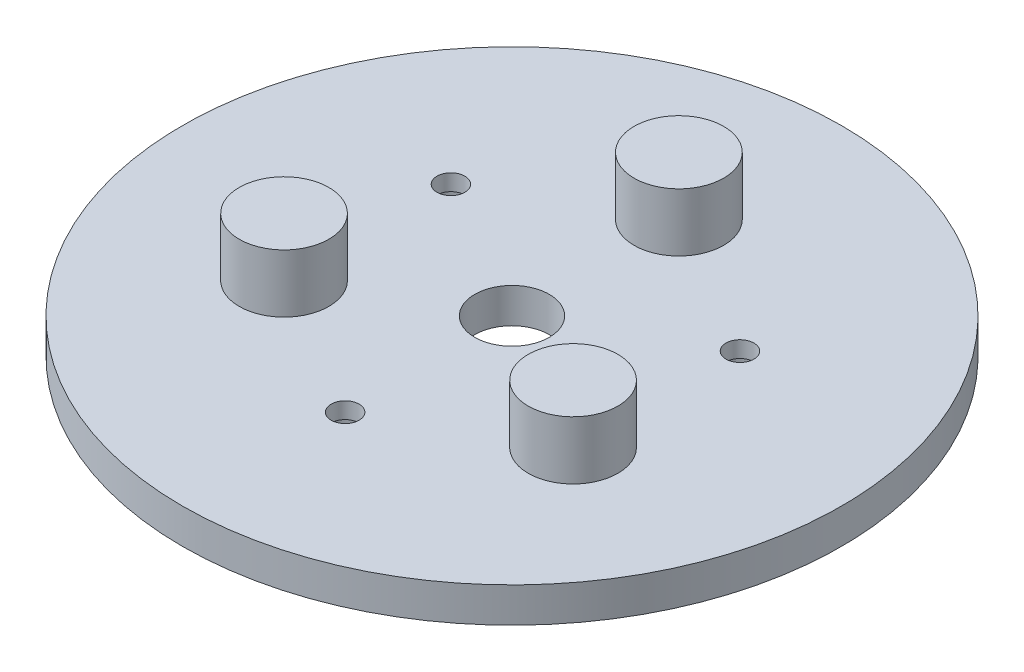
ISO-10303-21;
HEADER;
FILE_DESCRIPTION(('STEP AP214'),'2;1');
FILE_NAME('part.step','',(''),(''),'','','');
FILE_SCHEMA(('AUTOMOTIVE_DESIGN { 1 0 10303 214 1 1 1 1 }'));
ENDSEC;
DATA;
#1=APPLICATION_CONTEXT('core data for automotive mechanical design processes');
#2=APPLICATION_PROTOCOL_DEFINITION('international standard','automotive_design',2000,#1);
#3=PRODUCT_CONTEXT('',#1,'mechanical');
#4=PRODUCT('Part','Part','',(#3));
#5=PRODUCT_RELATED_PRODUCT_CATEGORY('part','',(#4));
#6=PRODUCT_DEFINITION_FORMATION('','',#4);
#7=PRODUCT_DEFINITION_CONTEXT('part definition',#1,'design');
#8=PRODUCT_DEFINITION('design','',#6,#7);
#9=PRODUCT_DEFINITION_SHAPE('','',#8);
#10=(LENGTH_UNIT() NAMED_UNIT(*) SI_UNIT(.MILLI.,.METRE.));
#11=(NAMED_UNIT(*) PLANE_ANGLE_UNIT() SI_UNIT($,.RADIAN.));
#12=(NAMED_UNIT(*) SI_UNIT($,.STERADIAN.) SOLID_ANGLE_UNIT());
#13=UNCERTAINTY_MEASURE_WITH_UNIT(LENGTH_MEASURE(1.E-05),#10,'distance_accuracy_value','');
#14=(GEOMETRIC_REPRESENTATION_CONTEXT(3) GLOBAL_UNCERTAINTY_ASSIGNED_CONTEXT((#13)) GLOBAL_UNIT_ASSIGNED_CONTEXT((#10,
#11,#12)) REPRESENTATION_CONTEXT('',''));
#15=CARTESIAN_POINT('',(0.,0.,0.));
#16=DIRECTION('',(0.,0.,1.));
#17=DIRECTION('',(1.,0.,0.));
#18=AXIS2_PLACEMENT_3D('',#15,#16,#17);
#19=CARTESIAN_POINT('',(0.,0.,0.));
#20=DIRECTION('',(0.,1.,0.));
#21=DIRECTION('',(0.,0.,1.));
#22=AXIS2_PLACEMENT_3D('',#19,#20,#21);
#23=PLANE('',#22);
#24=CARTESIAN_POINT('',(1.791477706596E-12,0.,14.3299999999989));
#25=DIRECTION('',(0.,-1.,0.));
#26=DIRECTION('',(0.,0.,-1.));
#27=AXIS2_PLACEMENT_3D('',#24,#25,#26);
#28=CIRCLE('',#27,2.5);
#29=CARTESIAN_POINT('',(1.791477706596E-12,0.,11.8299999999989));
#30=VERTEX_POINT('',#29);
#31=EDGE_CURVE('E159',#30,#30,#28,.T.);
#32=ORIENTED_EDGE('',*,*,#31,.F.);
#33=EDGE_LOOP('',(#32));
#34=FACE_BOUND('',#33,.T.);
#35=CARTESIAN_POINT('',(-12.410144036231,0.,-7.16499999999897));
#36=DIRECTION('',(0.,-1.,0.));
#37=DIRECTION('',(0.,0.,-1.));
#38=AXIS2_PLACEMENT_3D('',#35,#36,#37);
#39=CIRCLE('',#38,2.5);
#40=CARTESIAN_POINT('',(-12.410144036231,0.,-9.66499999999896));
#41=VERTEX_POINT('',#40);
#42=EDGE_CURVE('E169',#41,#41,#39,.T.);
#43=ORIENTED_EDGE('',*,*,#42,.F.);
#44=EDGE_LOOP('',(#43));
#45=FACE_BOUND('',#44,.T.);
#46=CARTESIAN_POINT('',(0.,0.,0.));
#47=DIRECTION('',(0.,1.,0.));
#48=DIRECTION('',(0.,0.,1.));
#49=AXIS2_PLACEMENT_3D('',#46,#47,#48);
#50=CIRCLE('',#49,28.3);
#51=CARTESIAN_POINT('',(0.,0.,28.3));
#52=VERTEX_POINT('',#51);
#53=EDGE_CURVE('E52',#52,#52,#50,.T.);
#54=ORIENTED_EDGE('',*,*,#53,.F.);
#55=EDGE_LOOP('',(#54));
#56=FACE_BOUND('',#55,.T.);
#57=CARTESIAN_POINT('',(0.,0.,0.));
#58=DIRECTION('',(0.,1.,0.));
#59=DIRECTION('',(0.,0.,1.));
#60=AXIS2_PLACEMENT_3D('',#57,#58,#59);
#61=CIRCLE('',#60,3.2);
#62=CARTESIAN_POINT('',(0.,0.,3.2));
#63=VERTEX_POINT('',#62);
#64=EDGE_CURVE('E66',#63,#63,#61,.T.);
#65=ORIENTED_EDGE('',*,*,#64,.T.);
#66=EDGE_LOOP('',(#65));
#67=FACE_BOUND('',#66,.T.);
#68=CARTESIAN_POINT('',(12.4101440362301,0.,-7.16500000000156));
#69=DIRECTION('',(0.,-1.,0.));
#70=DIRECTION('',(0.,0.,-1.));
#71=AXIS2_PLACEMENT_3D('',#68,#69,#70);
#72=CIRCLE('',#71,2.5);
#73=CARTESIAN_POINT('',(12.4101440362301,0.,-9.66500000000155));
#74=VERTEX_POINT('',#73);
#75=EDGE_CURVE('E181',#74,#74,#72,.T.);
#76=ORIENTED_EDGE('',*,*,#75,.F.);
#77=EDGE_LOOP('',(#76));
#78=FACE_BOUND('',#77,.T.);
#79=ADVANCED_FACE('F33',(#34,#45,#56,#67,#78),#23,.F.);
#80=CARTESIAN_POINT('',(0.,8.,-14.33));
#81=DIRECTION('',(0.,-1.,0.));
#82=DIRECTION('',(0.,0.,-1.));
#83=AXIS2_PLACEMENT_3D('',#80,#81,#82);
#84=CYLINDRICAL_SURFACE('',#83,3.85);
#85=CARTESIAN_POINT('',(0.,3.,-14.33));
#86=DIRECTION('',(0.,1.,0.));
#87=DIRECTION('',(0.,0.,1.));
#88=AXIS2_PLACEMENT_3D('',#85,#86,#87);
#89=CIRCLE('',#88,3.85);
#90=CARTESIAN_POINT('',(0.,3.,-10.48));
#91=VERTEX_POINT('',#90);
#92=EDGE_CURVE('E44',#91,#91,#89,.T.);
#93=ORIENTED_EDGE('',*,*,#92,.T.);
#94=EDGE_LOOP('',(#93));
#95=FACE_BOUND('',#94,.T.);
#96=CARTESIAN_POINT('',(0.,8.,-14.33));
#97=DIRECTION('',(0.,1.,0.));
#98=DIRECTION('',(0.,0.,1.));
#99=AXIS2_PLACEMENT_3D('',#96,#97,#98);
#100=CIRCLE('',#99,3.85);
#101=CARTESIAN_POINT('',(0.,8.,-10.48));
#102=VERTEX_POINT('',#101);
#103=EDGE_CURVE('E10',#102,#102,#100,.T.);
#104=ORIENTED_EDGE('',*,*,#103,.F.);
#105=EDGE_LOOP('',(#104));
#106=FACE_BOUND('',#105,.T.);
#107=ADVANCED_FACE('F35',(#95,#106),#84,.T.);
#108=CARTESIAN_POINT('',(0.,8.,0.));
#109=DIRECTION('',(0.,1.,0.));
#110=DIRECTION('',(0.,0.,1.));
#111=AXIS2_PLACEMENT_3D('',#108,#109,#110);
#112=PLANE('',#111);
#113=ORIENTED_EDGE('',*,*,#103,.T.);
#114=EDGE_LOOP('',(#113));
#115=FACE_BOUND('',#114,.T.);
#116=ADVANCED_FACE('F85',(#115),#112,.T.);
#117=CARTESIAN_POINT('',(0.,3.,0.));
#118=DIRECTION('',(0.,-1.,0.));
#119=DIRECTION('',(0.,0.,-1.));
#120=AXIS2_PLACEMENT_3D('',#117,#118,#119);
#121=CYLINDRICAL_SURFACE('',#120,28.3);
#122=CARTESIAN_POINT('',(0.,3.,0.));
#123=DIRECTION('',(0.,1.,0.));
#124=DIRECTION('',(0.,0.,1.));
#125=AXIS2_PLACEMENT_3D('',#122,#123,#124);
#126=CIRCLE('',#125,28.3);
#127=CARTESIAN_POINT('',(0.,3.,28.3));
#128=VERTEX_POINT('',#127);
#129=EDGE_CURVE('E40',#128,#128,#126,.T.);
#130=ORIENTED_EDGE('',*,*,#129,.F.);
#131=EDGE_LOOP('',(#130));
#132=FACE_BOUND('',#131,.T.);
#133=ORIENTED_EDGE('',*,*,#53,.T.);
#134=EDGE_LOOP('',(#133));
#135=FACE_BOUND('',#134,.T.);
#136=ADVANCED_FACE('F78',(#132,#135),#121,.T.);
#137=CARTESIAN_POINT('',(0.,3.,0.));
#138=DIRECTION('',(0.,1.,0.));
#139=DIRECTION('',(0.,0.,1.));
#140=AXIS2_PLACEMENT_3D('',#137,#138,#139);
#141=PLANE('',#140);
#142=CARTESIAN_POINT('',(1.791477706596E-12,3.,14.3299999999989));
#143=DIRECTION('',(0.,-1.,0.));
#144=DIRECTION('',(0.,0.,-1.));
#145=AXIS2_PLACEMENT_3D('',#142,#143,#144);
#146=CIRCLE('',#145,1.2);
#147=CARTESIAN_POINT('',(1.791477706596E-12,3.,13.1299999999989));
#148=VERTEX_POINT('',#147);
#149=EDGE_CURVE('E166',#148,#148,#146,.T.);
#150=ORIENTED_EDGE('',*,*,#149,.T.);
#151=EDGE_LOOP('',(#150));
#152=FACE_BOUND('',#151,.T.);
#153=CARTESIAN_POINT('',(-12.410144036231,3.,-7.16499999999897));
#154=DIRECTION('',(0.,-1.,0.));
#155=DIRECTION('',(0.,0.,-1.));
#156=AXIS2_PLACEMENT_3D('',#153,#154,#155);
#157=CIRCLE('',#156,1.2);
#158=CARTESIAN_POINT('',(-12.410144036231,3.,-8.36499999999896));
#159=VERTEX_POINT('',#158);
#160=EDGE_CURVE('E178',#159,#159,#157,.T.);
#161=ORIENTED_EDGE('',*,*,#160,.T.);
#162=EDGE_LOOP('',(#161));
#163=FACE_BOUND('',#162,.T.);
#164=CARTESIAN_POINT('',(12.4101440362301,3.,-7.16500000000156));
#165=DIRECTION('',(0.,-1.,0.));
#166=DIRECTION('',(0.,0.,-1.));
#167=AXIS2_PLACEMENT_3D('',#164,#165,#166);
#168=CIRCLE('',#167,1.2);
#169=CARTESIAN_POINT('',(12.4101440362301,3.,-8.36500000000155));
#170=VERTEX_POINT('',#169);
#171=EDGE_CURVE('E190',#170,#170,#168,.T.);
#172=ORIENTED_EDGE('',*,*,#171,.T.);
#173=EDGE_LOOP('',(#172));
#174=FACE_BOUND('',#173,.T.);
#175=CARTESIAN_POINT('',(0.,3.,0.));
#176=DIRECTION('',(0.,1.,0.));
#177=DIRECTION('',(0.,0.,1.));
#178=AXIS2_PLACEMENT_3D('',#175,#176,#177);
#179=CIRCLE('',#178,3.2);
#180=CARTESIAN_POINT('',(0.,3.,3.2));
#181=VERTEX_POINT('',#180);
#182=EDGE_CURVE('E193',#181,#181,#179,.T.);
#183=ORIENTED_EDGE('',*,*,#182,.F.);
#184=EDGE_LOOP('',(#183));
#185=FACE_BOUND('',#184,.T.);
#186=CARTESIAN_POINT('',(-12.4101440362301,3.,7.16500000000053));
#187=DIRECTION('',(0.,1.,0.));
#188=DIRECTION('',(0.,0.,1.));
#189=AXIS2_PLACEMENT_3D('',#186,#187,#188);
#190=CIRCLE('',#189,3.85000000000116);
#191=CARTESIAN_POINT('',(-12.4101440362301,3.,11.0150000000017));
#192=VERTEX_POINT('',#191);
#193=EDGE_CURVE('E54',#192,#192,#190,.T.);
#194=ORIENTED_EDGE('',*,*,#193,.F.);
#195=EDGE_LOOP('',(#194));
#196=FACE_BOUND('',#195,.T.);
#197=CARTESIAN_POINT('',(12.4101440362319,3.,7.16499999999947));
#198=DIRECTION('',(0.,1.,0.));
#199=DIRECTION('',(0.,0.,1.));
#200=AXIS2_PLACEMENT_3D('',#197,#198,#199);
#201=CIRCLE('',#200,3.85000000000079);
#202=CARTESIAN_POINT('',(12.4101440362319,3.,11.0150000000003));
#203=VERTEX_POINT('',#202);
#204=EDGE_CURVE('E49',#203,#203,#201,.T.);
#205=ORIENTED_EDGE('',*,*,#204,.F.);
#206=EDGE_LOOP('',(#205));
#207=FACE_BOUND('',#206,.T.);
#208=ORIENTED_EDGE('',*,*,#92,.F.);
#209=EDGE_LOOP('',(#208));
#210=FACE_BOUND('',#209,.T.);
#211=ORIENTED_EDGE('',*,*,#129,.T.);
#212=EDGE_LOOP('',(#211));
#213=FACE_BOUND('',#212,.T.);
#214=ADVANCED_FACE('F75',(#152,#163,#174,#185,#196,#207,#210,#213),#141,.T.);
#215=CARTESIAN_POINT('',(12.4101440362319,8.,7.16499999999947));
#216=DIRECTION('',(0.,-1.,0.));
#217=DIRECTION('',(0.,0.,-1.));
#218=AXIS2_PLACEMENT_3D('',#215,#216,#217);
#219=CYLINDRICAL_SURFACE('',#218,3.85000000000079);
#220=ORIENTED_EDGE('',*,*,#204,.T.);
#221=EDGE_LOOP('',(#220));
#222=FACE_BOUND('',#221,.T.);
#223=CARTESIAN_POINT('',(12.4101440362319,8.,7.16499999999947));
#224=DIRECTION('',(0.,1.,0.));
#225=DIRECTION('',(0.,0.,1.));
#226=AXIS2_PLACEMENT_3D('',#223,#224,#225);
#227=CIRCLE('',#226,3.85000000000079);
#228=CARTESIAN_POINT('',(12.4101440362319,8.,11.0150000000003));
#229=VERTEX_POINT('',#228);
#230=EDGE_CURVE('E55',#229,#229,#227,.T.);
#231=ORIENTED_EDGE('',*,*,#230,.F.);
#232=EDGE_LOOP('',(#231));
#233=FACE_BOUND('',#232,.T.);
#234=ADVANCED_FACE('F72',(#222,#233),#219,.T.);
#235=CARTESIAN_POINT('',(0.,8.,0.));
#236=DIRECTION('',(0.,1.,0.));
#237=DIRECTION('',(0.,0.,1.));
#238=AXIS2_PLACEMENT_3D('',#235,#236,#237);
#239=PLANE('',#238);
#240=ORIENTED_EDGE('',*,*,#230,.T.);
#241=EDGE_LOOP('',(#240));
#242=FACE_BOUND('',#241,.T.);
#243=ADVANCED_FACE('F102',(#242),#239,.T.);
#244=CARTESIAN_POINT('',(-12.4101440362301,8.,7.16500000000053));
#245=DIRECTION('',(0.,-1.,0.));
#246=DIRECTION('',(0.,0.,-1.));
#247=AXIS2_PLACEMENT_3D('',#244,#245,#246);
#248=CYLINDRICAL_SURFACE('',#247,3.85000000000116);
#249=ORIENTED_EDGE('',*,*,#193,.T.);
#250=EDGE_LOOP('',(#249));
#251=FACE_BOUND('',#250,.T.);
#252=CARTESIAN_POINT('',(-12.4101440362301,8.,7.16500000000053));
#253=DIRECTION('',(0.,1.,0.));
#254=DIRECTION('',(0.,0.,1.));
#255=AXIS2_PLACEMENT_3D('',#252,#253,#254);
#256=CIRCLE('',#255,3.85000000000116);
#257=CARTESIAN_POINT('',(-12.4101440362301,8.,11.0150000000017));
#258=VERTEX_POINT('',#257);
#259=EDGE_CURVE('E61',#258,#258,#256,.T.);
#260=ORIENTED_EDGE('',*,*,#259,.F.);
#261=EDGE_LOOP('',(#260));
#262=FACE_BOUND('',#261,.T.);
#263=ADVANCED_FACE('F105',(#251,#262),#248,.T.);
#264=CARTESIAN_POINT('',(0.,8.,0.));
#265=DIRECTION('',(0.,1.,0.));
#266=DIRECTION('',(0.,0.,1.));
#267=AXIS2_PLACEMENT_3D('',#264,#265,#266);
#268=PLANE('',#267);
#269=ORIENTED_EDGE('',*,*,#259,.T.);
#270=EDGE_LOOP('',(#269));
#271=FACE_BOUND('',#270,.T.);
#272=ADVANCED_FACE('F108',(#271),#268,.T.);
#273=CARTESIAN_POINT('',(0.,0.,0.));
#274=DIRECTION('',(0.,1.,0.));
#275=DIRECTION('',(0.,0.,1.));
#276=AXIS2_PLACEMENT_3D('',#273,#274,#275);
#277=CYLINDRICAL_SURFACE('',#276,3.2);
#278=ORIENTED_EDGE('',*,*,#64,.F.);
#279=EDGE_LOOP('',(#278));
#280=FACE_BOUND('',#279,.T.);
#281=ORIENTED_EDGE('',*,*,#182,.T.);
#282=EDGE_LOOP('',(#281));
#283=FACE_BOUND('',#282,.T.);
#284=ADVANCED_FACE('F112',(#280,#283),#277,.F.);
#285=CARTESIAN_POINT('',(12.4101440362301,0.,-7.16500000000156));
#286=DIRECTION('',(0.,-1.,0.));
#287=DIRECTION('',(0.,0.,-1.));
#288=AXIS2_PLACEMENT_3D('',#285,#286,#287);
#289=CYLINDRICAL_SURFACE('',#288,1.2);
#290=ORIENTED_EDGE('',*,*,#171,.F.);
#291=EDGE_LOOP('',(#290));
#292=FACE_BOUND('',#291,.T.);
#293=CARTESIAN_POINT('',(12.4101440362301,1.6,-7.16500000000156));
#294=DIRECTION('',(0.,-1.,0.));
#295=DIRECTION('',(0.,0.,-1.));
#296=AXIS2_PLACEMENT_3D('',#293,#294,#295);
#297=CIRCLE('',#296,1.2);
#298=CARTESIAN_POINT('',(12.4101440362301,1.6,-8.36500000000155));
#299=VERTEX_POINT('',#298);
#300=EDGE_CURVE('E187',#299,#299,#297,.T.);
#301=ORIENTED_EDGE('',*,*,#300,.T.);
#302=EDGE_LOOP('',(#301));
#303=FACE_BOUND('',#302,.T.);
#304=ADVANCED_FACE('F116',(#292,#303),#289,.F.);
#305=CARTESIAN_POINT('',(13.6101440362301,1.6,-7.16500000000156));
#306=DIRECTION('',(0.,1.,0.));
#307=DIRECTION('',(0.,0.,1.));
#308=AXIS2_PLACEMENT_3D('',#305,#306,#307);
#309=PLANE('',#308);
#310=ORIENTED_EDGE('',*,*,#300,.F.);
#311=EDGE_LOOP('',(#310));
#312=FACE_BOUND('',#311,.T.);
#313=CARTESIAN_POINT('',(12.4101440362301,1.6,-7.16500000000156));
#314=DIRECTION('',(0.,-1.,0.));
#315=DIRECTION('',(0.,0.,-1.));
#316=AXIS2_PLACEMENT_3D('',#313,#314,#315);
#317=CIRCLE('',#316,2.5);
#318=CARTESIAN_POINT('',(12.4101440362301,1.6,-9.66500000000155));
#319=VERTEX_POINT('',#318);
#320=EDGE_CURVE('E184',#319,#319,#317,.T.);
#321=ORIENTED_EDGE('',*,*,#320,.T.);
#322=EDGE_LOOP('',(#321));
#323=FACE_BOUND('',#322,.T.);
#324=ADVANCED_FACE('F120',(#312,#323),#309,.F.);
#325=CARTESIAN_POINT('',(12.4101440362301,0.,-7.16500000000156));
#326=DIRECTION('',(0.,-1.,0.));
#327=DIRECTION('',(0.,0.,-1.));
#328=AXIS2_PLACEMENT_3D('',#325,#326,#327);
#329=CYLINDRICAL_SURFACE('',#328,2.5);
#330=ORIENTED_EDGE('',*,*,#320,.F.);
#331=EDGE_LOOP('',(#330));
#332=FACE_BOUND('',#331,.T.);
#333=ORIENTED_EDGE('',*,*,#75,.T.);
#334=EDGE_LOOP('',(#333));
#335=FACE_BOUND('',#334,.T.);
#336=ADVANCED_FACE('F124',(#332,#335),#329,.F.);
#337=CARTESIAN_POINT('',(-12.410144036231,0.,-7.16499999999897));
#338=DIRECTION('',(0.,-1.,0.));
#339=DIRECTION('',(0.,0.,-1.));
#340=AXIS2_PLACEMENT_3D('',#337,#338,#339);
#341=CYLINDRICAL_SURFACE('',#340,1.2);
#342=ORIENTED_EDGE('',*,*,#160,.F.);
#343=EDGE_LOOP('',(#342));
#344=FACE_BOUND('',#343,.T.);
#345=CARTESIAN_POINT('',(-12.410144036231,1.6,-7.16499999999897));
#346=DIRECTION('',(0.,-1.,0.));
#347=DIRECTION('',(0.,0.,-1.));
#348=AXIS2_PLACEMENT_3D('',#345,#346,#347);
#349=CIRCLE('',#348,1.2);
#350=CARTESIAN_POINT('',(-12.410144036231,1.6,-8.36499999999896));
#351=VERTEX_POINT('',#350);
#352=EDGE_CURVE('E175',#351,#351,#349,.T.);
#353=ORIENTED_EDGE('',*,*,#352,.T.);
#354=EDGE_LOOP('',(#353));
#355=FACE_BOUND('',#354,.T.);
#356=ADVANCED_FACE('F128',(#344,#355),#341,.F.);
#357=CARTESIAN_POINT('',(-11.210144036231,1.6,-7.16499999999897));
#358=DIRECTION('',(0.,1.,0.));
#359=DIRECTION('',(0.,0.,1.));
#360=AXIS2_PLACEMENT_3D('',#357,#358,#359);
#361=PLANE('',#360);
#362=ORIENTED_EDGE('',*,*,#352,.F.);
#363=EDGE_LOOP('',(#362));
#364=FACE_BOUND('',#363,.T.);
#365=CARTESIAN_POINT('',(-12.410144036231,1.6,-7.16499999999897));
#366=DIRECTION('',(0.,-1.,0.));
#367=DIRECTION('',(0.,0.,-1.));
#368=AXIS2_PLACEMENT_3D('',#365,#366,#367);
#369=CIRCLE('',#368,2.5);
#370=CARTESIAN_POINT('',(-12.410144036231,1.6,-9.66499999999896));
#371=VERTEX_POINT('',#370);
#372=EDGE_CURVE('E172',#371,#371,#369,.T.);
#373=ORIENTED_EDGE('',*,*,#372,.T.);
#374=EDGE_LOOP('',(#373));
#375=FACE_BOUND('',#374,.T.);
#376=ADVANCED_FACE('F132',(#364,#375),#361,.F.);
#377=CARTESIAN_POINT('',(-12.410144036231,0.,-7.16499999999897));
#378=DIRECTION('',(0.,-1.,0.));
#379=DIRECTION('',(0.,0.,-1.));
#380=AXIS2_PLACEMENT_3D('',#377,#378,#379);
#381=CYLINDRICAL_SURFACE('',#380,2.5);
#382=ORIENTED_EDGE('',*,*,#372,.F.);
#383=EDGE_LOOP('',(#382));
#384=FACE_BOUND('',#383,.T.);
#385=ORIENTED_EDGE('',*,*,#42,.T.);
#386=EDGE_LOOP('',(#385));
#387=FACE_BOUND('',#386,.T.);
#388=ADVANCED_FACE('F136',(#384,#387),#381,.F.);
#389=CARTESIAN_POINT('',(1.791477706596E-12,0.,14.3299999999989));
#390=DIRECTION('',(0.,-1.,0.));
#391=DIRECTION('',(0.,0.,-1.));
#392=AXIS2_PLACEMENT_3D('',#389,#390,#391);
#393=CYLINDRICAL_SURFACE('',#392,1.2);
#394=ORIENTED_EDGE('',*,*,#149,.F.);
#395=EDGE_LOOP('',(#394));
#396=FACE_BOUND('',#395,.T.);
#397=CARTESIAN_POINT('',(1.791477706596E-12,1.6,14.3299999999989));
#398=DIRECTION('',(0.,-1.,0.));
#399=DIRECTION('',(0.,0.,-1.));
#400=AXIS2_PLACEMENT_3D('',#397,#398,#399);
#401=CIRCLE('',#400,1.2);
#402=CARTESIAN_POINT('',(1.791477706596E-12,1.6,13.1299999999989));
#403=VERTEX_POINT('',#402);
#404=EDGE_CURVE('E161',#403,#403,#401,.T.);
#405=ORIENTED_EDGE('',*,*,#404,.T.);
#406=EDGE_LOOP('',(#405));
#407=FACE_BOUND('',#406,.T.);
#408=ADVANCED_FACE('F140',(#396,#407),#393,.F.);
#409=CARTESIAN_POINT('',(1.20000000000179,1.6,14.3299999999989));
#410=DIRECTION('',(0.,1.,0.));
#411=DIRECTION('',(0.,0.,1.));
#412=AXIS2_PLACEMENT_3D('',#409,#410,#411);
#413=PLANE('',#412);
#414=ORIENTED_EDGE('',*,*,#404,.F.);
#415=EDGE_LOOP('',(#414));
#416=FACE_BOUND('',#415,.T.);
#417=CARTESIAN_POINT('',(1.791477706596E-12,1.6,14.3299999999989));
#418=DIRECTION('',(0.,-1.,0.));
#419=DIRECTION('',(0.,0.,-1.));
#420=AXIS2_PLACEMENT_3D('',#417,#418,#419);
#421=CIRCLE('',#420,2.5);
#422=CARTESIAN_POINT('',(1.791477706596E-12,1.6,11.8299999999989));
#423=VERTEX_POINT('',#422);
#424=EDGE_CURVE('E157',#423,#423,#421,.T.);
#425=ORIENTED_EDGE('',*,*,#424,.T.);
#426=EDGE_LOOP('',(#425));
#427=FACE_BOUND('',#426,.T.);
#428=ADVANCED_FACE('F144',(#416,#427),#413,.F.);
#429=CARTESIAN_POINT('',(1.791477706596E-12,0.,14.3299999999989));
#430=DIRECTION('',(0.,-1.,0.));
#431=DIRECTION('',(0.,0.,-1.));
#432=AXIS2_PLACEMENT_3D('',#429,#430,#431);
#433=CYLINDRICAL_SURFACE('',#432,2.5);
#434=ORIENTED_EDGE('',*,*,#424,.F.);
#435=EDGE_LOOP('',(#434));
#436=FACE_BOUND('',#435,.T.);
#437=ORIENTED_EDGE('',*,*,#31,.T.);
#438=EDGE_LOOP('',(#437));
#439=FACE_BOUND('',#438,.T.);
#440=ADVANCED_FACE('F148',(#436,#439),#433,.F.);
#441=CLOSED_SHELL('',(#79,#107,#116,#136,#214,#234,#243,#263,#272,#284,#304,#324,#336,#356,#376,
#388,#408,#428,#440));
#442=MANIFOLD_SOLID_BREP('B2',#441);
#443=ADVANCED_BREP_SHAPE_REPRESENTATION('',(#18,#442),#14);
#444=SHAPE_DEFINITION_REPRESENTATION(#9,#443);
ENDSEC;
END-ISO-10303-21;
